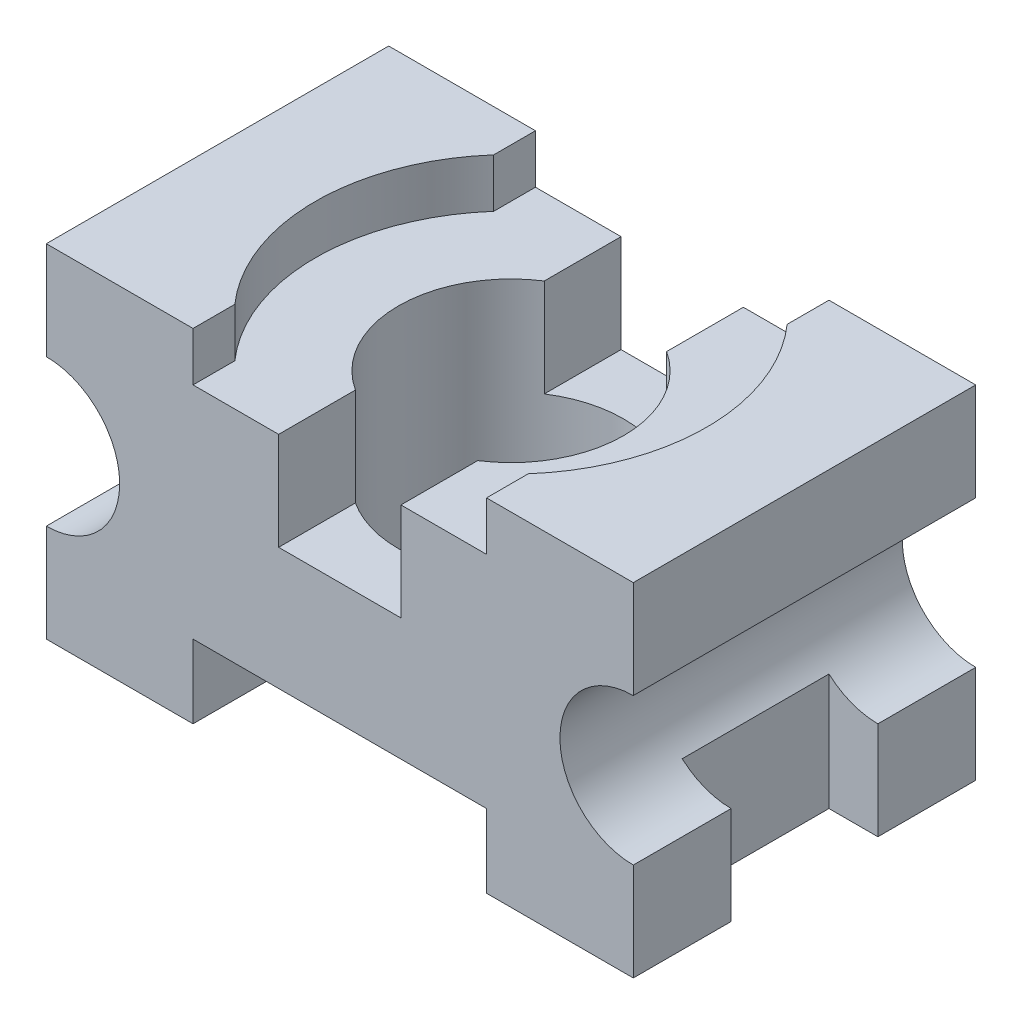
ISO-10303-21;
HEADER;
FILE_DESCRIPTION(('STEP AP214'),'2;1');
FILE_NAME('part.step','',(''),(''),'','','');
FILE_SCHEMA(('AUTOMOTIVE_DESIGN { 1 0 10303 214 1 1 1 1 }'));
ENDSEC;
DATA;
#1=APPLICATION_CONTEXT('core data for automotive mechanical design processes');
#2=APPLICATION_PROTOCOL_DEFINITION('international standard','automotive_design',2000,#1);
#3=PRODUCT_CONTEXT('',#1,'mechanical');
#4=PRODUCT('Part','Part','',(#3));
#5=PRODUCT_RELATED_PRODUCT_CATEGORY('part','',(#4));
#6=PRODUCT_DEFINITION_FORMATION('','',#4);
#7=PRODUCT_DEFINITION_CONTEXT('part definition',#1,'design');
#8=PRODUCT_DEFINITION('design','',#6,#7);
#9=PRODUCT_DEFINITION_SHAPE('','',#8);
#10=(LENGTH_UNIT() NAMED_UNIT(*) SI_UNIT(.MILLI.,.METRE.));
#11=(NAMED_UNIT(*) PLANE_ANGLE_UNIT() SI_UNIT($,.RADIAN.));
#12=(NAMED_UNIT(*) SI_UNIT($,.STERADIAN.) SOLID_ANGLE_UNIT());
#13=UNCERTAINTY_MEASURE_WITH_UNIT(LENGTH_MEASURE(1.E-05),#10,'distance_accuracy_value','');
#14=(GEOMETRIC_REPRESENTATION_CONTEXT(3) GLOBAL_UNCERTAINTY_ASSIGNED_CONTEXT((#13)) GLOBAL_UNIT_ASSIGNED_CONTEXT((#10,
#11,#12)) REPRESENTATION_CONTEXT('',''));
#15=CARTESIAN_POINT('',(0.,0.,0.));
#16=DIRECTION('',(0.,0.,1.));
#17=DIRECTION('',(1.,0.,0.));
#18=AXIS2_PLACEMENT_3D('',#15,#16,#17);
#19=CARTESIAN_POINT('',(59.9369075355242,-25.7154386100894,70.));
#20=DIRECTION('',(-1.,0.,0.));
#21=DIRECTION('',(0.,0.,1.));
#22=AXIS2_PLACEMENT_3D('',#19,#20,#21);
#23=PLANE('',#22);
#24=DIRECTION('',(0.,0.,-1.));
#25=VECTOR('',#24,1.);
#26=CARTESIAN_POINT('',(59.9369075355242,-45.7154386100894,70.));
#27=LINE('',#26,#25);
#28=CARTESIAN_POINT('',(59.9369075355242,-45.7154386100894,70.));
#29=VERTEX_POINT('',#28);
#30=CARTESIAN_POINT('',(59.9369075355242,-45.7154386100894,50.));
#31=VERTEX_POINT('',#30);
#32=EDGE_CURVE('E591',#29,#31,#27,.T.);
#33=ORIENTED_EDGE('',*,*,#32,.T.);
#34=DIRECTION('',(0.,-1.,0.));
#35=VECTOR('',#34,1.);
#36=CARTESIAN_POINT('',(59.9369075355242,0.,50.));
#37=LINE('',#36,#35);
#38=CARTESIAN_POINT('',(59.9369075355242,-25.7154386100894,50.));
#39=VERTEX_POINT('',#38);
#40=EDGE_CURVE('E287',#39,#31,#37,.T.);
#41=ORIENTED_EDGE('',*,*,#40,.F.);
#42=DIRECTION('',(0.,0.,-1.));
#43=VECTOR('',#42,1.);
#44=CARTESIAN_POINT('',(59.9369075355242,-25.7154386100894,70.));
#45=LINE('',#44,#43);
#46=CARTESIAN_POINT('',(59.9369075355242,-25.7154386100894,70.));
#47=VERTEX_POINT('',#46);
#48=EDGE_CURVE('E586',#47,#39,#45,.T.);
#49=ORIENTED_EDGE('',*,*,#48,.F.);
#50=DIRECTION('',(0.,1.,0.));
#51=VECTOR('',#50,1.);
#52=CARTESIAN_POINT('',(59.9369075355242,-25.7154386100894,70.));
#53=LINE('',#52,#51);
#54=EDGE_CURVE('E404',#29,#47,#53,.T.);
#55=ORIENTED_EDGE('',*,*,#54,.F.);
#56=EDGE_LOOP('',(#33,#41,#49,#55));
#57=FACE_BOUND('',#56,.T.);
#58=ADVANCED_FACE('F39',(#57),#23,.F.);
#59=CARTESIAN_POINT('',(-60.0630924644758,-45.7154386100894,70.));
#60=DIRECTION('',(0.,1.,0.));
#61=DIRECTION('',(0.,0.,1.));
#62=AXIS2_PLACEMENT_3D('',#59,#60,#61);
#63=PLANE('',#62);
#64=DIRECTION('',(-1.,0.,0.));
#65=VECTOR('',#64,1.);
#66=CARTESIAN_POINT('',(-50.0630924644758,-45.7154386100894,50.));
#67=LINE('',#66,#65);
#68=CARTESIAN_POINT('',(-50.0630924644758,-45.7154386100894,50.));
#69=VERTEX_POINT('',#68);
#70=CARTESIAN_POINT('',(-60.0630924644758,-45.7154386100894,50.));
#71=VERTEX_POINT('',#70);
#72=EDGE_CURVE('E322',#69,#71,#67,.T.);
#73=ORIENTED_EDGE('',*,*,#72,.F.);
#74=DIRECTION('',(0.,0.,1.));
#75=VECTOR('',#74,1.);
#76=CARTESIAN_POINT('',(-50.0630924644758,-45.7154386100894,0.));
#77=LINE('',#76,#75);
#78=CARTESIAN_POINT('',(-50.0630924644758,-45.7154386100894,20.));
#79=VERTEX_POINT('',#78);
#80=EDGE_CURVE('E315',#79,#69,#77,.T.);
#81=ORIENTED_EDGE('',*,*,#80,.F.);
#82=DIRECTION('',(-1.,0.,0.));
#83=VECTOR('',#82,1.);
#84=CARTESIAN_POINT('',(-50.0630924644758,-45.7154386100894,20.));
#85=LINE('',#84,#83);
#86=CARTESIAN_POINT('',(-60.0630924644758,-45.7154386100894,20.));
#87=VERTEX_POINT('',#86);
#88=EDGE_CURVE('E319',#79,#87,#85,.T.);
#89=ORIENTED_EDGE('',*,*,#88,.T.);
#90=DIRECTION('',(0.,0.,-1.));
#91=VECTOR('',#90,1.);
#92=CARTESIAN_POINT('',(-60.0630924644758,-45.7154386100894,70.));
#93=LINE('',#92,#91);
#94=CARTESIAN_POINT('',(-60.0630924644758,-45.7154386100894,0.));
#95=VERTEX_POINT('',#94);
#96=EDGE_CURVE('E449',#87,#95,#93,.T.);
#97=ORIENTED_EDGE('',*,*,#96,.T.);
#98=DIRECTION('',(1.,0.,0.));
#99=VECTOR('',#98,1.);
#100=CARTESIAN_POINT('',(-60.0630924644758,-45.7154386100894,0.));
#101=LINE('',#100,#99);
#102=CARTESIAN_POINT('',(-30.0630924644758,-45.7154386100894,0.));
#103=VERTEX_POINT('',#102);
#104=EDGE_CURVE('E386',#95,#103,#101,.T.);
#105=ORIENTED_EDGE('',*,*,#104,.T.);
#106=DIRECTION('',(0.,0.,-1.));
#107=VECTOR('',#106,1.);
#108=CARTESIAN_POINT('',(-30.0630924644758,-45.7154386100894,70.));
#109=LINE('',#108,#107);
#110=CARTESIAN_POINT('',(-30.0630924644758,-45.7154386100894,70.));
#111=VERTEX_POINT('',#110);
#112=EDGE_CURVE('E606',#111,#103,#109,.T.);
#113=ORIENTED_EDGE('',*,*,#112,.F.);
#114=DIRECTION('',(1.,0.,0.));
#115=VECTOR('',#114,1.);
#116=CARTESIAN_POINT('',(-60.0630924644758,-45.7154386100894,70.));
#117=LINE('',#116,#115);
#118=CARTESIAN_POINT('',(-60.0630924644758,-45.7154386100894,70.));
#119=VERTEX_POINT('',#118);
#120=EDGE_CURVE('E387',#119,#111,#117,.T.);
#121=ORIENTED_EDGE('',*,*,#120,.F.);
#122=EDGE_CURVE('E520',#119,#71,#93,.T.);
#123=ORIENTED_EDGE('',*,*,#122,.T.);
#124=EDGE_LOOP('',(#73,#81,#89,#97,#105,#113,#121,#123));
#125=FACE_BOUND('',#124,.T.);
#126=ADVANCED_FACE('F41',(#125),#63,.F.);
#127=CARTESIAN_POINT('',(-60.0630924644758,-10.7154386100894,70.));
#128=DIRECTION('',(0.,0.,-1.));
#129=DIRECTION('',(-1.,0.,0.));
#130=AXIS2_PLACEMENT_3D('',#127,#128,#129);
#131=CYLINDRICAL_SURFACE('',#130,15.);
#132=CARTESIAN_POINT('',(-60.0630924644758,-10.7154386100894,50.));
#133=DIRECTION('',(0.,0.,-1.));
#134=DIRECTION('',(-1.,0.,0.));
#135=AXIS2_PLACEMENT_3D('',#132,#133,#134);
#136=CIRCLE('',#135,15.);
#137=CARTESIAN_POINT('',(-60.0630924644758,-25.7154386100894,50.));
#138=VERTEX_POINT('',#137);
#139=CARTESIAN_POINT('',(-50.0630924644758,-21.8957784975883,50.));
#140=VERTEX_POINT('',#139);
#141=EDGE_CURVE('E330',#138,#140,#136,.F.);
#142=ORIENTED_EDGE('',*,*,#141,.F.);
#143=DIRECTION('',(0.,0.,-1.));
#144=VECTOR('',#143,1.);
#145=CARTESIAN_POINT('',(-60.0630924644758,-25.7154386100894,70.));
#146=LINE('',#145,#144);
#147=CARTESIAN_POINT('',(-60.0630924644758,-25.7154386100894,70.));
#148=VERTEX_POINT('',#147);
#149=EDGE_CURVE('E525',#148,#138,#146,.T.);
#150=ORIENTED_EDGE('',*,*,#149,.F.);
#151=CARTESIAN_POINT('',(-60.0630924644758,-10.7154386100894,70.));
#152=DIRECTION('',(0.,0.,-1.));
#153=DIRECTION('',(1.,0.,0.));
#154=AXIS2_PLACEMENT_3D('',#151,#152,#153);
#155=CIRCLE('',#154,15.);
#156=CARTESIAN_POINT('',(-60.0630924644758,4.28456138991064,70.));
#157=VERTEX_POINT('',#156);
#158=EDGE_CURVE('E443',#157,#148,#155,.T.);
#159=ORIENTED_EDGE('',*,*,#158,.F.);
#160=DIRECTION('',(0.,0.,-1.));
#161=VECTOR('',#160,1.);
#162=CARTESIAN_POINT('',(-60.0630924644758,4.28456138991064,70.));
#163=LINE('',#162,#161);
#164=CARTESIAN_POINT('',(-60.0630924644758,4.28456138991064,0.));
#165=VERTEX_POINT('',#164);
#166=EDGE_CURVE('E529',#157,#165,#163,.T.);
#167=ORIENTED_EDGE('',*,*,#166,.T.);
#168=CARTESIAN_POINT('',(-60.0630924644758,-10.7154386100894,0.));
#169=DIRECTION('',(0.,0.,-1.));
#170=DIRECTION('',(1.,0.,0.));
#171=AXIS2_PLACEMENT_3D('',#168,#169,#170);
#172=CIRCLE('',#171,15.);
#173=CARTESIAN_POINT('',(-60.0630924644758,-25.7154386100894,0.));
#174=VERTEX_POINT('',#173);
#175=EDGE_CURVE('E513',#165,#174,#172,.T.);
#176=ORIENTED_EDGE('',*,*,#175,.T.);
#177=CARTESIAN_POINT('',(-60.0630924644758,-25.7154386100894,20.));
#178=VERTEX_POINT('',#177);
#179=EDGE_CURVE('E524',#178,#174,#146,.T.);
#180=ORIENTED_EDGE('',*,*,#179,.F.);
#181=CARTESIAN_POINT('',(-60.0630924644758,-10.7154386100894,20.));
#182=DIRECTION('',(0.,0.,1.));
#183=DIRECTION('',(1.,0.,0.));
#184=AXIS2_PLACEMENT_3D('',#181,#182,#183);
#185=CIRCLE('',#184,15.);
#186=CARTESIAN_POINT('',(-50.0630924644758,-21.8957784975883,20.));
#187=VERTEX_POINT('',#186);
#188=EDGE_CURVE('E63',#187,#178,#185,.F.);
#189=ORIENTED_EDGE('',*,*,#188,.F.);
#190=DIRECTION('',(0.,0.,-1.));
#191=VECTOR('',#190,1.);
#192=CARTESIAN_POINT('',(-50.0630924644758,-21.8957784975883,70.));
#193=LINE('',#192,#191);
#194=EDGE_CURVE('E617',#140,#187,#193,.T.);
#195=ORIENTED_EDGE('',*,*,#194,.F.);
#196=EDGE_LOOP('',(#142,#150,#159,#167,#176,#180,#189,#195));
#197=FACE_BOUND('',#196,.T.);
#198=ADVANCED_FACE('F710',(#197),#131,.F.);
#199=CARTESIAN_POINT('',(-60.0630924644758,-25.7154386100894,70.));
#200=DIRECTION('',(1.,0.,0.));
#201=DIRECTION('',(0.,0.,-1.));
#202=AXIS2_PLACEMENT_3D('',#199,#200,#201);
#203=PLANE('',#202);
#204=DIRECTION('',(0.,1.,0.));
#205=VECTOR('',#204,1.);
#206=CARTESIAN_POINT('',(-60.0630924644758,-25.7154386100894,50.));
#207=LINE('',#206,#205);
#208=EDGE_CURVE('E614',#71,#138,#207,.T.);
#209=ORIENTED_EDGE('',*,*,#208,.F.);
#210=ORIENTED_EDGE('',*,*,#122,.F.);
#211=DIRECTION('',(0.,-1.,0.));
#212=VECTOR('',#211,1.);
#213=CARTESIAN_POINT('',(-60.0630924644758,-25.7154386100894,70.));
#214=LINE('',#213,#212);
#215=EDGE_CURVE('E446',#148,#119,#214,.T.);
#216=ORIENTED_EDGE('',*,*,#215,.F.);
#217=ORIENTED_EDGE('',*,*,#149,.T.);
#218=EDGE_LOOP('',(#209,#210,#216,#217));
#219=FACE_BOUND('',#218,.T.);
#220=ADVANCED_FACE('F717',(#219),#203,.F.);
#221=DIRECTION('',(0.,1.,0.));
#222=VECTOR('',#221,1.);
#223=CARTESIAN_POINT('',(-60.0630924644758,0.,20.));
#224=LINE('',#223,#222);
#225=EDGE_CURVE('E307',#87,#178,#224,.T.);
#226=ORIENTED_EDGE('',*,*,#225,.T.);
#227=ORIENTED_EDGE('',*,*,#179,.T.);
#228=DIRECTION('',(0.,-1.,0.));
#229=VECTOR('',#228,1.);
#230=CARTESIAN_POINT('',(-60.0630924644758,-25.7154386100894,0.));
#231=LINE('',#230,#229);
#232=EDGE_CURVE('E392',#174,#95,#231,.T.);
#233=ORIENTED_EDGE('',*,*,#232,.T.);
#234=ORIENTED_EDGE('',*,*,#96,.F.);
#235=EDGE_LOOP('',(#226,#227,#233,#234));
#236=FACE_BOUND('',#235,.T.);
#237=ADVANCED_FACE('F904',(#236),#203,.F.);
#238=CARTESIAN_POINT('',(12.4369075355242,14.2845613899106,70.));
#239=DIRECTION('',(1.,0.,0.));
#240=DIRECTION('',(0.,0.,-1.));
#241=AXIS2_PLACEMENT_3D('',#238,#239,#240);
#242=PLANE('',#241);
#243=DIRECTION('',(0.,0.,-1.));
#244=VECTOR('',#243,1.);
#245=CARTESIAN_POINT('',(12.4369075355242,-5.71543861008936,70.));
#246=LINE('',#245,#244);
#247=CARTESIAN_POINT('',(12.4369075355242,-5.71543861008936,15.6932654236922));
#248=VERTEX_POINT('',#247);
#249=CARTESIAN_POINT('',(12.4369075355242,-5.71543861008936,0.));
#250=VERTEX_POINT('',#249);
#251=EDGE_CURVE('E557',#248,#250,#246,.T.);
#252=ORIENTED_EDGE('',*,*,#251,.F.);
#253=DIRECTION('',(0.,1.,0.));
#254=VECTOR('',#253,1.);
#255=CARTESIAN_POINT('',(12.4369075355242,-51.7154386100894,15.6932654236922));
#256=LINE('',#255,#254);
#257=CARTESIAN_POINT('',(12.4369075355242,14.2845613899106,15.6932654236922));
#258=VERTEX_POINT('',#257);
#259=EDGE_CURVE('E344',#248,#258,#256,.T.);
#260=ORIENTED_EDGE('',*,*,#259,.T.);
#261=DIRECTION('',(0.,0.,-1.));
#262=VECTOR('',#261,1.);
#263=CARTESIAN_POINT('',(12.4369075355242,14.2845613899106,70.));
#264=LINE('',#263,#262);
#265=CARTESIAN_POINT('',(12.4369075355242,14.2845613899106,0.));
#266=VERTEX_POINT('',#265);
#267=EDGE_CURVE('E562',#258,#266,#264,.T.);
#268=ORIENTED_EDGE('',*,*,#267,.T.);
#269=DIRECTION('',(0.,-1.,0.));
#270=VECTOR('',#269,1.);
#271=CARTESIAN_POINT('',(12.4369075355242,14.2845613899106,0.));
#272=LINE('',#271,#270);
#273=EDGE_CURVE('E488',#266,#250,#272,.T.);
#274=ORIENTED_EDGE('',*,*,#273,.T.);
#275=EDGE_LOOP('',(#252,#260,#268,#274));
#276=FACE_BOUND('',#275,.T.);
#277=ADVANCED_FACE('F678',(#276),#242,.F.);
#278=CARTESIAN_POINT('',(-12.5630924644758,-5.71543861008936,70.));
#279=DIRECTION('',(0.,-1.,0.));
#280=DIRECTION('',(0.,0.,-1.));
#281=AXIS2_PLACEMENT_3D('',#278,#279,#280);
#282=PLANE('',#281);
#283=CARTESIAN_POINT('',(12.4369075355242,-5.71543861008936,70.));
#284=VERTEX_POINT('',#283);
#285=CARTESIAN_POINT('',(12.4369075355242,-5.71543861008936,54.3067345763078));
#286=VERTEX_POINT('',#285);
#287=EDGE_CURVE('E558',#284,#286,#246,.T.);
#288=ORIENTED_EDGE('',*,*,#287,.T.);
#289=CARTESIAN_POINT('',(-0.063092464475837,-5.71543861008936,35.));
#290=DIRECTION('',(0.,-1.,0.));
#291=DIRECTION('',(0.,0.,-1.));
#292=AXIS2_PLACEMENT_3D('',#289,#290,#291);
#293=CIRCLE('',#292,23.);
#294=CARTESIAN_POINT('',(-12.5630924644758,-5.71543861008936,54.3067345763078));
#295=VERTEX_POINT('',#294);
#296=EDGE_CURVE('E345',#286,#295,#293,.T.);
#297=ORIENTED_EDGE('',*,*,#296,.T.);
#298=DIRECTION('',(0.,0.,-1.));
#299=VECTOR('',#298,1.);
#300=CARTESIAN_POINT('',(-12.5630924644758,-5.71543861008936,70.));
#301=LINE('',#300,#299);
#302=CARTESIAN_POINT('',(-12.5630924644758,-5.71543861008936,70.));
#303=VERTEX_POINT('',#302);
#304=EDGE_CURVE('E553',#303,#295,#301,.T.);
#305=ORIENTED_EDGE('',*,*,#304,.F.);
#306=DIRECTION('',(-1.,0.,0.));
#307=VECTOR('',#306,1.);
#308=CARTESIAN_POINT('',(-12.5630924644758,-5.71543861008936,70.));
#309=LINE('',#308,#307);
#310=EDGE_CURVE('E425',#284,#303,#309,.T.);
#311=ORIENTED_EDGE('',*,*,#310,.F.);
#312=EDGE_LOOP('',(#288,#297,#305,#311));
#313=FACE_BOUND('',#312,.T.);
#314=ADVANCED_FACE('F651',(#313),#282,.F.);
#315=CARTESIAN_POINT('',(-12.5630924644758,14.2845613899106,70.));
#316=DIRECTION('',(-1.,0.,0.));
#317=DIRECTION('',(0.,0.,1.));
#318=AXIS2_PLACEMENT_3D('',#315,#316,#317);
#319=PLANE('',#318);
#320=ORIENTED_EDGE('',*,*,#304,.T.);
#321=DIRECTION('',(0.,1.,0.));
#322=VECTOR('',#321,1.);
#323=CARTESIAN_POINT('',(-12.5630924644758,-51.7154386100894,54.3067345763078));
#324=LINE('',#323,#322);
#325=CARTESIAN_POINT('',(-12.5630924644758,14.2845613899106,54.3067345763078));
#326=VERTEX_POINT('',#325);
#327=EDGE_CURVE('E349',#295,#326,#324,.T.);
#328=ORIENTED_EDGE('',*,*,#327,.T.);
#329=DIRECTION('',(0.,0.,-1.));
#330=VECTOR('',#329,1.);
#331=CARTESIAN_POINT('',(-12.5630924644758,14.2845613899106,70.));
#332=LINE('',#331,#330);
#333=CARTESIAN_POINT('',(-12.5630924644758,14.2845613899106,70.));
#334=VERTEX_POINT('',#333);
#335=EDGE_CURVE('E548',#334,#326,#332,.T.);
#336=ORIENTED_EDGE('',*,*,#335,.F.);
#337=DIRECTION('',(0.,1.,0.));
#338=VECTOR('',#337,1.);
#339=CARTESIAN_POINT('',(-12.5630924644758,14.2845613899106,70.));
#340=LINE('',#339,#338);
#341=EDGE_CURVE('E428',#303,#334,#340,.T.);
#342=ORIENTED_EDGE('',*,*,#341,.F.);
#343=EDGE_LOOP('',(#320,#328,#336,#342));
#344=FACE_BOUND('',#343,.T.);
#345=ADVANCED_FACE('F657',(#344),#319,.F.);
#346=CARTESIAN_POINT('',(29.9369075355242,24.2845613899106,70.));
#347=DIRECTION('',(1.,0.,0.));
#348=DIRECTION('',(0.,0.,-1.));
#349=AXIS2_PLACEMENT_3D('',#346,#347,#348);
#350=PLANE('',#349);
#351=DIRECTION('',(0.,0.,-1.));
#352=VECTOR('',#351,1.);
#353=CARTESIAN_POINT('',(29.9369075355242,14.2845613899106,70.));
#354=LINE('',#353,#352);
#355=CARTESIAN_POINT('',(29.9369075355242,14.2845613899106,8.5424868893541));
#356=VERTEX_POINT('',#355);
#357=CARTESIAN_POINT('',(29.9369075355242,14.2845613899106,0.));
#358=VERTEX_POINT('',#357);
#359=EDGE_CURVE('E567',#356,#358,#354,.T.);
#360=ORIENTED_EDGE('',*,*,#359,.F.);
#361=DIRECTION('',(0.,1.,0.));
#362=VECTOR('',#361,1.);
#363=CARTESIAN_POINT('',(29.9369075355242,14.2845613899106,8.5424868893541));
#364=LINE('',#363,#362);
#365=CARTESIAN_POINT('',(29.9369075355242,24.2845613899106,8.5424868893541));
#366=VERTEX_POINT('',#365);
#367=EDGE_CURVE('E382',#356,#366,#364,.T.);
#368=ORIENTED_EDGE('',*,*,#367,.T.);
#369=DIRECTION('',(0.,0.,-1.));
#370=VECTOR('',#369,1.);
#371=CARTESIAN_POINT('',(29.9369075355242,24.2845613899106,70.));
#372=LINE('',#371,#370);
#373=CARTESIAN_POINT('',(29.9369075355242,24.2845613899106,0.));
#374=VERTEX_POINT('',#373);
#375=EDGE_CURVE('E572',#366,#374,#372,.T.);
#376=ORIENTED_EDGE('',*,*,#375,.T.);
#377=DIRECTION('',(0.,-1.,0.));
#378=VECTOR('',#377,1.);
#379=CARTESIAN_POINT('',(29.9369075355242,24.2845613899106,0.));
#380=LINE('',#379,#378);
#381=EDGE_CURVE('E480',#374,#358,#380,.T.);
#382=ORIENTED_EDGE('',*,*,#381,.T.);
#383=EDGE_LOOP('',(#360,#368,#376,#382));
#384=FACE_BOUND('',#383,.T.);
#385=ADVANCED_FACE('F761',(#384),#350,.F.);
#386=CARTESIAN_POINT('',(-30.0630924644758,24.2845613899106,70.));
#387=DIRECTION('',(-1.,0.,0.));
#388=DIRECTION('',(0.,0.,1.));
#389=AXIS2_PLACEMENT_3D('',#386,#387,#388);
#390=PLANE('',#389);
#391=DIRECTION('',(0.,0.,-1.));
#392=VECTOR('',#391,1.);
#393=CARTESIAN_POINT('',(-30.0630924644758,14.2845613899106,70.));
#394=LINE('',#393,#392);
#395=CARTESIAN_POINT('',(-30.0630924644758,14.2845613899106,70.));
#396=VERTEX_POINT('',#395);
#397=CARTESIAN_POINT('',(-30.0630924644758,14.2845613899106,61.4575131106459));
#398=VERTEX_POINT('',#397);
#399=EDGE_CURVE('E543',#396,#398,#394,.T.);
#400=ORIENTED_EDGE('',*,*,#399,.T.);
#401=DIRECTION('',(0.,1.,0.));
#402=VECTOR('',#401,1.);
#403=CARTESIAN_POINT('',(-30.0630924644758,14.2845613899106,61.4575131106459));
#404=LINE('',#403,#402);
#405=CARTESIAN_POINT('',(-30.0630924644758,24.2845613899106,61.4575131106459));
#406=VERTEX_POINT('',#405);
#407=EDGE_CURVE('E374',#398,#406,#404,.T.);
#408=ORIENTED_EDGE('',*,*,#407,.T.);
#409=DIRECTION('',(0.,0.,-1.));
#410=VECTOR('',#409,1.);
#411=CARTESIAN_POINT('',(-30.0630924644758,24.2845613899106,70.));
#412=LINE('',#411,#410);
#413=CARTESIAN_POINT('',(-30.0630924644758,24.2845613899106,70.));
#414=VERTEX_POINT('',#413);
#415=EDGE_CURVE('E538',#414,#406,#412,.T.);
#416=ORIENTED_EDGE('',*,*,#415,.F.);
#417=DIRECTION('',(0.,1.,0.));
#418=VECTOR('',#417,1.);
#419=CARTESIAN_POINT('',(-30.0630924644758,24.2845613899106,70.));
#420=LINE('',#419,#418);
#421=EDGE_CURVE('E434',#396,#414,#420,.T.);
#422=ORIENTED_EDGE('',*,*,#421,.F.);
#423=EDGE_LOOP('',(#400,#408,#416,#422));
#424=FACE_BOUND('',#423,.T.);
#425=ADVANCED_FACE('F694',(#424),#390,.F.);
#426=CARTESIAN_POINT('',(-30.0630924644758,-45.7154386100894,70.));
#427=DIRECTION('',(-1.,0.,0.));
#428=DIRECTION('',(0.,0.,1.));
#429=AXIS2_PLACEMENT_3D('',#426,#427,#428);
#430=PLANE('',#429);
#431=DIRECTION('',(0.,1.,0.));
#432=VECTOR('',#431,1.);
#433=CARTESIAN_POINT('',(-30.0630924644758,-45.7154386100894,0.));
#434=LINE('',#433,#432);
#435=CARTESIAN_POINT('',(-30.0630924644758,-30.7154386100894,0.));
#436=VERTEX_POINT('',#435);
#437=EDGE_CURVE('E453',#103,#436,#434,.T.);
#438=ORIENTED_EDGE('',*,*,#437,.T.);
#439=DIRECTION('',(0.,0.,-1.));
#440=VECTOR('',#439,1.);
#441=CARTESIAN_POINT('',(-30.0630924644758,-30.7154386100894,70.));
#442=LINE('',#441,#440);
#443=CARTESIAN_POINT('',(-30.0630924644758,-30.7154386100894,70.));
#444=VERTEX_POINT('',#443);
#445=EDGE_CURVE('E602',#444,#436,#442,.T.);
#446=ORIENTED_EDGE('',*,*,#445,.F.);
#447=DIRECTION('',(0.,1.,0.));
#448=VECTOR('',#447,1.);
#449=CARTESIAN_POINT('',(-30.0630924644758,-45.7154386100894,70.));
#450=LINE('',#449,#448);
#451=EDGE_CURVE('E391',#111,#444,#450,.T.);
#452=ORIENTED_EDGE('',*,*,#451,.F.);
#453=ORIENTED_EDGE('',*,*,#112,.T.);
#454=EDGE_LOOP('',(#438,#446,#452,#453));
#455=FACE_BOUND('',#454,.T.);
#456=ADVANCED_FACE('F722',(#455),#430,.F.);
#457=CARTESIAN_POINT('',(-30.0630924644758,-30.7154386100894,70.));
#458=DIRECTION('',(0.,1.,0.));
#459=DIRECTION('',(0.,0.,1.));
#460=AXIS2_PLACEMENT_3D('',#457,#458,#459);
#461=PLANE('',#460);
#462=CARTESIAN_POINT('',(-0.063092464475837,-30.7154386100894,35.));
#463=DIRECTION('',(0.,1.,0.));
#464=DIRECTION('',(0.,0.,1.));
#465=AXIS2_PLACEMENT_3D('',#462,#463,#464);
#466=CIRCLE('',#465,23.);
#467=CARTESIAN_POINT('',(-0.063092464475837,-30.7154386100894,58.));
#468=VERTEX_POINT('',#467);
#469=EDGE_CURVE('E357',#468,#468,#466,.T.);
#470=ORIENTED_EDGE('',*,*,#469,.T.);
#471=EDGE_LOOP('',(#470));
#472=FACE_BOUND('',#471,.T.);
#473=DIRECTION('',(1.,0.,0.));
#474=VECTOR('',#473,1.);
#475=CARTESIAN_POINT('',(-30.0630924644758,-30.7154386100894,0.));
#476=LINE('',#475,#474);
#477=CARTESIAN_POINT('',(29.9369075355242,-30.7154386100894,0.));
#478=VERTEX_POINT('',#477);
#479=EDGE_CURVE('E456',#436,#478,#476,.T.);
#480=ORIENTED_EDGE('',*,*,#479,.T.);
#481=DIRECTION('',(0.,0.,-1.));
#482=VECTOR('',#481,1.);
#483=CARTESIAN_POINT('',(29.9369075355242,-30.7154386100894,70.));
#484=LINE('',#483,#482);
#485=CARTESIAN_POINT('',(29.9369075355242,-30.7154386100894,70.));
#486=VERTEX_POINT('',#485);
#487=EDGE_CURVE('E598',#486,#478,#484,.T.);
#488=ORIENTED_EDGE('',*,*,#487,.F.);
#489=DIRECTION('',(1.,0.,0.));
#490=VECTOR('',#489,1.);
#491=CARTESIAN_POINT('',(-30.0630924644758,-30.7154386100894,70.));
#492=LINE('',#491,#490);
#493=EDGE_CURVE('E395',#444,#486,#492,.T.);
#494=ORIENTED_EDGE('',*,*,#493,.F.);
#495=ORIENTED_EDGE('',*,*,#445,.T.);
#496=EDGE_LOOP('',(#480,#488,#494,#495));
#497=FACE_BOUND('',#496,.T.);
#498=ADVANCED_FACE('F729',(#472,#497),#461,.F.);
#499=CARTESIAN_POINT('',(29.9369075355242,-45.7154386100894,70.));
#500=DIRECTION('',(1.,0.,0.));
#501=DIRECTION('',(0.,0.,-1.));
#502=AXIS2_PLACEMENT_3D('',#499,#500,#501);
#503=PLANE('',#502);
#504=DIRECTION('',(0.,-1.,0.));
#505=VECTOR('',#504,1.);
#506=CARTESIAN_POINT('',(29.9369075355242,-45.7154386100894,0.));
#507=LINE('',#506,#505);
#508=CARTESIAN_POINT('',(29.9369075355242,-45.7154386100894,0.));
#509=VERTEX_POINT('',#508);
#510=EDGE_CURVE('E459',#478,#509,#507,.T.);
#511=ORIENTED_EDGE('',*,*,#510,.T.);
#512=DIRECTION('',(0.,0.,-1.));
#513=VECTOR('',#512,1.);
#514=CARTESIAN_POINT('',(29.9369075355242,-45.7154386100894,70.));
#515=LINE('',#514,#513);
#516=CARTESIAN_POINT('',(29.9369075355242,-45.7154386100894,70.));
#517=VERTEX_POINT('',#516);
#518=EDGE_CURVE('E594',#517,#509,#515,.T.);
#519=ORIENTED_EDGE('',*,*,#518,.F.);
#520=DIRECTION('',(0.,-1.,0.));
#521=VECTOR('',#520,1.);
#522=CARTESIAN_POINT('',(29.9369075355242,-45.7154386100894,70.));
#523=LINE('',#522,#521);
#524=EDGE_CURVE('E398',#486,#517,#523,.T.);
#525=ORIENTED_EDGE('',*,*,#524,.F.);
#526=ORIENTED_EDGE('',*,*,#487,.T.);
#527=EDGE_LOOP('',(#511,#519,#525,#526));
#528=FACE_BOUND('',#527,.T.);
#529=ADVANCED_FACE('F733',(#528),#503,.F.);
#530=CARTESIAN_POINT('',(59.9369075355242,-45.7154386100894,70.));
#531=DIRECTION('',(0.,1.,0.));
#532=DIRECTION('',(0.,0.,1.));
#533=AXIS2_PLACEMENT_3D('',#530,#531,#532);
#534=PLANE('',#533);
#535=DIRECTION('',(0.,0.,1.));
#536=VECTOR('',#535,1.);
#537=CARTESIAN_POINT('',(49.9369075355242,-45.7154386100894,0.));
#538=LINE('',#537,#536);
#539=CARTESIAN_POINT('',(49.9369075355242,-45.7154386100894,20.));
#540=VERTEX_POINT('',#539);
#541=CARTESIAN_POINT('',(49.9369075355242,-45.7154386100894,50.));
#542=VERTEX_POINT('',#541);
#543=EDGE_CURVE('E276',#540,#542,#538,.T.);
#544=ORIENTED_EDGE('',*,*,#543,.T.);
#545=DIRECTION('',(1.,0.,0.));
#546=VECTOR('',#545,1.);
#547=CARTESIAN_POINT('',(49.9369075355242,-45.7154386100894,50.));
#548=LINE('',#547,#546);
#549=EDGE_CURVE('E284',#542,#31,#548,.T.);
#550=ORIENTED_EDGE('',*,*,#549,.T.);
#551=ORIENTED_EDGE('',*,*,#32,.F.);
#552=DIRECTION('',(1.,0.,0.));
#553=VECTOR('',#552,1.);
#554=CARTESIAN_POINT('',(59.9369075355242,-45.7154386100894,70.));
#555=LINE('',#554,#553);
#556=EDGE_CURVE('E401',#517,#29,#555,.T.);
#557=ORIENTED_EDGE('',*,*,#556,.F.);
#558=ORIENTED_EDGE('',*,*,#518,.T.);
#559=DIRECTION('',(1.,0.,0.));
#560=VECTOR('',#559,1.);
#561=CARTESIAN_POINT('',(59.9369075355242,-45.7154386100894,0.));
#562=LINE('',#561,#560);
#563=CARTESIAN_POINT('',(59.9369075355242,-45.7154386100894,0.));
#564=VERTEX_POINT('',#563);
#565=EDGE_CURVE('E462',#509,#564,#562,.T.);
#566=ORIENTED_EDGE('',*,*,#565,.T.);
#567=CARTESIAN_POINT('',(59.9369075355242,-45.7154386100894,20.));
#568=VERTEX_POINT('',#567);
#569=EDGE_CURVE('E590',#568,#564,#27,.T.);
#570=ORIENTED_EDGE('',*,*,#569,.F.);
#571=DIRECTION('',(1.,0.,0.));
#572=VECTOR('',#571,1.);
#573=CARTESIAN_POINT('',(49.9369075355242,-45.7154386100894,20.));
#574=LINE('',#573,#572);
#575=EDGE_CURVE('E292',#540,#568,#574,.T.);
#576=ORIENTED_EDGE('',*,*,#575,.F.);
#577=EDGE_LOOP('',(#544,#550,#551,#557,#558,#566,#570,#576));
#578=FACE_BOUND('',#577,.T.);
#579=ADVANCED_FACE('F295',(#578),#534,.F.);
#580=CARTESIAN_POINT('',(59.9369075355242,-25.7154386100894,20.));
#581=VERTEX_POINT('',#580);
#582=CARTESIAN_POINT('',(59.9369075355242,-25.7154386100894,0.));
#583=VERTEX_POINT('',#582);
#584=EDGE_CURVE('E585',#581,#583,#45,.T.);
#585=ORIENTED_EDGE('',*,*,#584,.F.);
#586=DIRECTION('',(0.,1.,0.));
#587=VECTOR('',#586,1.);
#588=CARTESIAN_POINT('',(59.9369075355242,0.,20.));
#589=LINE('',#588,#587);
#590=EDGE_CURVE('E281',#568,#581,#589,.T.);
#591=ORIENTED_EDGE('',*,*,#590,.F.);
#592=ORIENTED_EDGE('',*,*,#569,.T.);
#593=DIRECTION('',(0.,1.,0.));
#594=VECTOR('',#593,1.);
#595=CARTESIAN_POINT('',(59.9369075355242,-25.7154386100894,0.));
#596=LINE('',#595,#594);
#597=EDGE_CURVE('E466',#564,#583,#596,.T.);
#598=ORIENTED_EDGE('',*,*,#597,.T.);
#599=EDGE_LOOP('',(#585,#591,#592,#598));
#600=FACE_BOUND('',#599,.T.);
#601=ADVANCED_FACE('F629',(#600),#23,.F.);
#602=CARTESIAN_POINT('',(59.9369075355242,-10.7154386100894,70.));
#603=DIRECTION('',(0.,0.,-1.));
#604=DIRECTION('',(-1.,0.,0.));
#605=AXIS2_PLACEMENT_3D('',#602,#603,#604);
#606=CYLINDRICAL_SURFACE('',#605,15.);
#607=ORIENTED_EDGE('',*,*,#48,.T.);
#608=CARTESIAN_POINT('',(59.9369075355242,-10.7154386100894,50.));
#609=DIRECTION('',(0.,0.,1.));
#610=DIRECTION('',(1.,0.,0.));
#611=AXIS2_PLACEMENT_3D('',#608,#609,#610);
#612=CIRCLE('',#611,15.);
#613=CARTESIAN_POINT('',(49.9369075355242,-21.8957784975883,50.));
#614=VERTEX_POINT('',#613);
#615=EDGE_CURVE('E11',#39,#614,#612,.F.);
#616=ORIENTED_EDGE('',*,*,#615,.T.);
#617=DIRECTION('',(0.,0.,-1.));
#618=VECTOR('',#617,1.);
#619=CARTESIAN_POINT('',(49.9369075355242,-21.8957784975883,70.));
#620=LINE('',#619,#618);
#621=CARTESIAN_POINT('',(49.9369075355242,-21.8957784975883,20.));
#622=VERTEX_POINT('',#621);
#623=EDGE_CURVE('E278',#622,#614,#620,.F.);
#624=ORIENTED_EDGE('',*,*,#623,.F.);
#625=CARTESIAN_POINT('',(59.9369075355242,-10.7154386100894,20.));
#626=DIRECTION('',(0.,0.,-1.));
#627=DIRECTION('',(-1.,0.,0.));
#628=AXIS2_PLACEMENT_3D('',#625,#626,#627);
#629=CIRCLE('',#628,15.);
#630=EDGE_CURVE('E48',#622,#581,#629,.F.);
#631=ORIENTED_EDGE('',*,*,#630,.T.);
#632=ORIENTED_EDGE('',*,*,#584,.T.);
#633=CARTESIAN_POINT('',(59.9369075355242,-10.7154386100894,0.));
#634=DIRECTION('',(0.,0.,-1.));
#635=DIRECTION('',(-1.,0.,0.));
#636=AXIS2_PLACEMENT_3D('',#633,#634,#635);
#637=CIRCLE('',#636,15.);
#638=CARTESIAN_POINT('',(59.9369075355242,4.28456138991064,0.));
#639=VERTEX_POINT('',#638);
#640=EDGE_CURVE('E470',#583,#639,#637,.T.);
#641=ORIENTED_EDGE('',*,*,#640,.T.);
#642=DIRECTION('',(0.,0.,-1.));
#643=VECTOR('',#642,1.);
#644=CARTESIAN_POINT('',(59.9369075355242,4.28456138991064,70.));
#645=LINE('',#644,#643);
#646=CARTESIAN_POINT('',(59.9369075355242,4.28456138991064,70.));
#647=VERTEX_POINT('',#646);
#648=EDGE_CURVE('E581',#647,#639,#645,.T.);
#649=ORIENTED_EDGE('',*,*,#648,.F.);
#650=CARTESIAN_POINT('',(59.9369075355242,-10.7154386100894,70.));
#651=DIRECTION('',(0.,0.,-1.));
#652=DIRECTION('',(-1.,0.,0.));
#653=AXIS2_PLACEMENT_3D('',#650,#651,#652);
#654=CIRCLE('',#653,15.);
#655=EDGE_CURVE('E407',#47,#647,#654,.T.);
#656=ORIENTED_EDGE('',*,*,#655,.F.);
#657=EDGE_LOOP('',(#607,#616,#624,#631,#632,#641,#649,#656));
#658=FACE_BOUND('',#657,.T.);
#659=ADVANCED_FACE('F625',(#658),#606,.F.);
#660=CARTESIAN_POINT('',(59.9369075355242,4.28456138991064,70.));
#661=DIRECTION('',(-1.,0.,0.));
#662=DIRECTION('',(0.,0.,1.));
#663=AXIS2_PLACEMENT_3D('',#660,#661,#662);
#664=PLANE('',#663);
#665=DIRECTION('',(0.,1.,0.));
#666=VECTOR('',#665,1.);
#667=CARTESIAN_POINT('',(59.9369075355242,4.28456138991064,0.));
#668=LINE('',#667,#666);
#669=CARTESIAN_POINT('',(59.9369075355242,24.2845613899106,0.));
#670=VERTEX_POINT('',#669);
#671=EDGE_CURVE('E473',#639,#670,#668,.T.);
#672=ORIENTED_EDGE('',*,*,#671,.T.);
#673=DIRECTION('',(0.,0.,-1.));
#674=VECTOR('',#673,1.);
#675=CARTESIAN_POINT('',(59.9369075355242,24.2845613899106,70.));
#676=LINE('',#675,#674);
#677=CARTESIAN_POINT('',(59.9369075355242,24.2845613899106,70.));
#678=VERTEX_POINT('',#677);
#679=EDGE_CURVE('E577',#678,#670,#676,.T.);
#680=ORIENTED_EDGE('',*,*,#679,.F.);
#681=DIRECTION('',(0.,1.,0.));
#682=VECTOR('',#681,1.);
#683=CARTESIAN_POINT('',(59.9369075355242,4.28456138991064,70.));
#684=LINE('',#683,#682);
#685=EDGE_CURVE('E410',#647,#678,#684,.T.);
#686=ORIENTED_EDGE('',*,*,#685,.F.);
#687=ORIENTED_EDGE('',*,*,#648,.T.);
#688=EDGE_LOOP('',(#672,#680,#686,#687));
#689=FACE_BOUND('',#688,.T.);
#690=ADVANCED_FACE('F745',(#689),#664,.F.);
#691=CARTESIAN_POINT('',(59.9369075355242,24.2845613899106,70.));
#692=DIRECTION('',(0.,-1.,0.));
#693=DIRECTION('',(0.,0.,-1.));
#694=AXIS2_PLACEMENT_3D('',#691,#692,#693);
#695=PLANE('',#694);
#696=ORIENTED_EDGE('',*,*,#375,.F.);
#697=CARTESIAN_POINT('',(-0.0630924644758335,24.2845613899106,35.));
#698=DIRECTION('',(0.,1.,0.));
#699=DIRECTION('',(0.,0.,1.));
#700=AXIS2_PLACEMENT_3D('',#697,#698,#699);
#701=CIRCLE('',#700,40.);
#702=CARTESIAN_POINT('',(29.9369075355242,24.2845613899106,61.4575131106459));
#703=VERTEX_POINT('',#702);
#704=EDGE_CURVE('E367',#703,#366,#701,.T.);
#705=ORIENTED_EDGE('',*,*,#704,.F.);
#706=CARTESIAN_POINT('',(29.9369075355242,24.2845613899106,70.));
#707=VERTEX_POINT('',#706);
#708=EDGE_CURVE('E573',#707,#703,#372,.T.);
#709=ORIENTED_EDGE('',*,*,#708,.F.);
#710=DIRECTION('',(-1.,0.,0.));
#711=VECTOR('',#710,1.);
#712=CARTESIAN_POINT('',(59.9369075355242,24.2845613899106,70.));
#713=LINE('',#712,#711);
#714=EDGE_CURVE('E413',#678,#707,#713,.T.);
#715=ORIENTED_EDGE('',*,*,#714,.F.);
#716=ORIENTED_EDGE('',*,*,#679,.T.);
#717=DIRECTION('',(-1.,0.,0.));
#718=VECTOR('',#717,1.);
#719=CARTESIAN_POINT('',(59.9369075355242,24.2845613899106,0.));
#720=LINE('',#719,#718);
#721=EDGE_CURVE('E476',#670,#374,#720,.T.);
#722=ORIENTED_EDGE('',*,*,#721,.T.);
#723=EDGE_LOOP('',(#696,#705,#709,#715,#716,#722));
#724=FACE_BOUND('',#723,.T.);
#725=ADVANCED_FACE('F753',(#724),#695,.F.);
#726=ORIENTED_EDGE('',*,*,#708,.T.);
#727=DIRECTION('',(0.,1.,0.));
#728=VECTOR('',#727,1.);
#729=CARTESIAN_POINT('',(29.9369075355242,14.2845613899106,61.4575131106459));
#730=LINE('',#729,#728);
#731=CARTESIAN_POINT('',(29.9369075355242,14.2845613899106,61.4575131106459));
#732=VERTEX_POINT('',#731);
#733=EDGE_CURVE('E378',#703,#732,#730,.F.);
#734=ORIENTED_EDGE('',*,*,#733,.T.);
#735=CARTESIAN_POINT('',(29.9369075355242,14.2845613899106,70.));
#736=VERTEX_POINT('',#735);
#737=EDGE_CURVE('E568',#736,#732,#354,.T.);
#738=ORIENTED_EDGE('',*,*,#737,.F.);
#739=DIRECTION('',(0.,-1.,0.));
#740=VECTOR('',#739,1.);
#741=CARTESIAN_POINT('',(29.9369075355242,24.2845613899106,70.));
#742=LINE('',#741,#740);
#743=EDGE_CURVE('E416',#707,#736,#742,.T.);
#744=ORIENTED_EDGE('',*,*,#743,.F.);
#745=EDGE_LOOP('',(#726,#734,#738,#744));
#746=FACE_BOUND('',#745,.T.);
#747=ADVANCED_FACE('F755',(#746),#350,.F.);
#748=CARTESIAN_POINT('',(29.9369075355242,14.2845613899106,70.));
#749=DIRECTION('',(0.,-1.,0.));
#750=DIRECTION('',(0.,0.,-1.));
#751=AXIS2_PLACEMENT_3D('',#748,#749,#750);
#752=PLANE('',#751);
#753=ORIENTED_EDGE('',*,*,#267,.F.);
#754=CARTESIAN_POINT('',(-0.063092464475837,14.2845613899106,35.));
#755=DIRECTION('',(0.,1.,0.));
#756=DIRECTION('',(0.,0.,1.));
#757=AXIS2_PLACEMENT_3D('',#754,#755,#756);
#758=CIRCLE('',#757,23.);
#759=CARTESIAN_POINT('',(12.4369075355242,14.2845613899106,54.3067345763078));
#760=VERTEX_POINT('',#759);
#761=EDGE_CURVE('E333',#760,#258,#758,.T.);
#762=ORIENTED_EDGE('',*,*,#761,.F.);
#763=CARTESIAN_POINT('',(12.4369075355242,14.2845613899106,70.));
#764=VERTEX_POINT('',#763);
#765=EDGE_CURVE('E563',#764,#760,#264,.T.);
#766=ORIENTED_EDGE('',*,*,#765,.F.);
#767=DIRECTION('',(-1.,0.,0.));
#768=VECTOR('',#767,1.);
#769=CARTESIAN_POINT('',(29.9369075355242,14.2845613899106,70.));
#770=LINE('',#769,#768);
#771=EDGE_CURVE('E419',#736,#764,#770,.T.);
#772=ORIENTED_EDGE('',*,*,#771,.F.);
#773=ORIENTED_EDGE('',*,*,#737,.T.);
#774=CARTESIAN_POINT('',(-0.0630924644758335,14.2845613899106,35.));
#775=DIRECTION('',(0.,1.,0.));
#776=DIRECTION('',(0.,0.,1.));
#777=AXIS2_PLACEMENT_3D('',#774,#775,#776);
#778=CIRCLE('',#777,40.);
#779=EDGE_CURVE('E366',#732,#356,#778,.T.);
#780=ORIENTED_EDGE('',*,*,#779,.T.);
#781=ORIENTED_EDGE('',*,*,#359,.T.);
#782=DIRECTION('',(-1.,0.,0.));
#783=VECTOR('',#782,1.);
#784=CARTESIAN_POINT('',(29.9369075355242,14.2845613899106,0.));
#785=LINE('',#784,#783);
#786=EDGE_CURVE('E484',#358,#266,#785,.T.);
#787=ORIENTED_EDGE('',*,*,#786,.T.);
#788=EDGE_LOOP('',(#753,#762,#766,#772,#773,#780,#781,#787));
#789=FACE_BOUND('',#788,.T.);
#790=ADVANCED_FACE('F673',(#789),#752,.F.);
#791=ORIENTED_EDGE('',*,*,#765,.T.);
#792=DIRECTION('',(0.,1.,0.));
#793=VECTOR('',#792,1.);
#794=CARTESIAN_POINT('',(12.4369075355242,-51.7154386100894,54.3067345763078));
#795=LINE('',#794,#793);
#796=EDGE_CURVE('E353',#760,#286,#795,.F.);
#797=ORIENTED_EDGE('',*,*,#796,.T.);
#798=ORIENTED_EDGE('',*,*,#287,.F.);
#799=DIRECTION('',(0.,-1.,0.));
#800=VECTOR('',#799,1.);
#801=CARTESIAN_POINT('',(12.4369075355242,14.2845613899106,70.));
#802=LINE('',#801,#800);
#803=EDGE_CURVE('E422',#764,#284,#802,.T.);
#804=ORIENTED_EDGE('',*,*,#803,.F.);
#805=EDGE_LOOP('',(#791,#797,#798,#804));
#806=FACE_BOUND('',#805,.T.);
#807=ADVANCED_FACE('F667',(#806),#242,.F.);
#808=CARTESIAN_POINT('',(-12.5630924644758,-5.71543861008936,15.6932654236922));
#809=VERTEX_POINT('',#808);
#810=CARTESIAN_POINT('',(-12.5630924644758,-5.71543861008936,0.));
#811=VERTEX_POINT('',#810);
#812=EDGE_CURVE('E552',#809,#811,#301,.T.);
#813=ORIENTED_EDGE('',*,*,#812,.F.);
#814=EDGE_CURVE('E340',#809,#248,#293,.T.);
#815=ORIENTED_EDGE('',*,*,#814,.T.);
#816=ORIENTED_EDGE('',*,*,#251,.T.);
#817=DIRECTION('',(-1.,0.,0.));
#818=VECTOR('',#817,1.);
#819=CARTESIAN_POINT('',(-12.5630924644758,-5.71543861008936,0.));
#820=LINE('',#819,#818);
#821=EDGE_CURVE('E492',#250,#811,#820,.T.);
#822=ORIENTED_EDGE('',*,*,#821,.T.);
#823=EDGE_LOOP('',(#813,#815,#816,#822));
#824=FACE_BOUND('',#823,.T.);
#825=ADVANCED_FACE('F682',(#824),#282,.F.);
#826=CARTESIAN_POINT('',(-12.5630924644758,14.2845613899106,15.6932654236922));
#827=VERTEX_POINT('',#826);
#828=CARTESIAN_POINT('',(-12.5630924644758,14.2845613899106,0.));
#829=VERTEX_POINT('',#828);
#830=EDGE_CURVE('E547',#827,#829,#332,.T.);
#831=ORIENTED_EDGE('',*,*,#830,.F.);
#832=DIRECTION('',(0.,1.,0.));
#833=VECTOR('',#832,1.);
#834=CARTESIAN_POINT('',(-12.5630924644758,-51.7154386100894,15.6932654236922));
#835=LINE('',#834,#833);
#836=EDGE_CURVE('E336',#827,#809,#835,.F.);
#837=ORIENTED_EDGE('',*,*,#836,.T.);
#838=ORIENTED_EDGE('',*,*,#812,.T.);
#839=DIRECTION('',(0.,1.,0.));
#840=VECTOR('',#839,1.);
#841=CARTESIAN_POINT('',(-12.5630924644758,14.2845613899106,0.));
#842=LINE('',#841,#840);
#843=EDGE_CURVE('E496',#811,#829,#842,.T.);
#844=ORIENTED_EDGE('',*,*,#843,.T.);
#845=EDGE_LOOP('',(#831,#837,#838,#844));
#846=FACE_BOUND('',#845,.T.);
#847=ADVANCED_FACE('F686',(#846),#319,.F.);
#848=CARTESIAN_POINT('',(-30.0630924644758,14.2845613899106,70.));
#849=DIRECTION('',(0.,-1.,0.));
#850=DIRECTION('',(0.,0.,-1.));
#851=AXIS2_PLACEMENT_3D('',#848,#849,#850);
#852=PLANE('',#851);
#853=ORIENTED_EDGE('',*,*,#335,.T.);
#854=CARTESIAN_POINT('',(-0.063092464475837,14.2845613899106,35.));
#855=DIRECTION('',(0.,-1.,0.));
#856=DIRECTION('',(0.,0.,-1.));
#857=AXIS2_PLACEMENT_3D('',#854,#855,#856);
#858=CIRCLE('',#857,23.);
#859=EDGE_CURVE('E610',#326,#827,#858,.T.);
#860=ORIENTED_EDGE('',*,*,#859,.T.);
#861=ORIENTED_EDGE('',*,*,#830,.T.);
#862=DIRECTION('',(-1.,0.,0.));
#863=VECTOR('',#862,1.);
#864=CARTESIAN_POINT('',(-30.0630924644758,14.2845613899106,0.));
#865=LINE('',#864,#863);
#866=CARTESIAN_POINT('',(-30.0630924644758,14.2845613899106,0.));
#867=VERTEX_POINT('',#866);
#868=EDGE_CURVE('E500',#829,#867,#865,.T.);
#869=ORIENTED_EDGE('',*,*,#868,.T.);
#870=CARTESIAN_POINT('',(-30.0630924644758,14.2845613899106,8.5424868893541));
#871=VERTEX_POINT('',#870);
#872=EDGE_CURVE('E542',#871,#867,#394,.T.);
#873=ORIENTED_EDGE('',*,*,#872,.F.);
#874=EDGE_CURVE('E362',#871,#398,#778,.T.);
#875=ORIENTED_EDGE('',*,*,#874,.T.);
#876=ORIENTED_EDGE('',*,*,#399,.F.);
#877=DIRECTION('',(-1.,0.,0.));
#878=VECTOR('',#877,1.);
#879=CARTESIAN_POINT('',(-30.0630924644758,14.2845613899106,70.));
#880=LINE('',#879,#878);
#881=EDGE_CURVE('E431',#334,#396,#880,.T.);
#882=ORIENTED_EDGE('',*,*,#881,.F.);
#883=EDGE_LOOP('',(#853,#860,#861,#869,#873,#875,#876,#882));
#884=FACE_BOUND('',#883,.T.);
#885=ADVANCED_FACE('F689',(#884),#852,.F.);
#886=CARTESIAN_POINT('',(-30.0630924644758,24.2845613899106,8.5424868893541));
#887=VERTEX_POINT('',#886);
#888=CARTESIAN_POINT('',(-30.0630924644758,24.2845613899106,0.));
#889=VERTEX_POINT('',#888);
#890=EDGE_CURVE('E537',#887,#889,#412,.T.);
#891=ORIENTED_EDGE('',*,*,#890,.F.);
#892=DIRECTION('',(0.,1.,0.));
#893=VECTOR('',#892,1.);
#894=CARTESIAN_POINT('',(-30.0630924644758,14.2845613899106,8.5424868893541));
#895=LINE('',#894,#893);
#896=EDGE_CURVE('E370',#887,#871,#895,.F.);
#897=ORIENTED_EDGE('',*,*,#896,.T.);
#898=ORIENTED_EDGE('',*,*,#872,.T.);
#899=DIRECTION('',(0.,1.,0.));
#900=VECTOR('',#899,1.);
#901=CARTESIAN_POINT('',(-30.0630924644758,24.2845613899106,0.));
#902=LINE('',#901,#900);
#903=EDGE_CURVE('E503',#867,#889,#902,.T.);
#904=ORIENTED_EDGE('',*,*,#903,.T.);
#905=EDGE_LOOP('',(#891,#897,#898,#904));
#906=FACE_BOUND('',#905,.T.);
#907=ADVANCED_FACE('F769',(#906),#390,.F.);
#908=CARTESIAN_POINT('',(-60.0630924644758,24.2845613899106,70.));
#909=DIRECTION('',(0.,-1.,0.));
#910=DIRECTION('',(0.,0.,-1.));
#911=AXIS2_PLACEMENT_3D('',#908,#909,#910);
#912=PLANE('',#911);
#913=ORIENTED_EDGE('',*,*,#415,.T.);
#914=EDGE_CURVE('E361',#887,#406,#701,.T.);
#915=ORIENTED_EDGE('',*,*,#914,.F.);
#916=ORIENTED_EDGE('',*,*,#890,.T.);
#917=DIRECTION('',(-1.,0.,0.));
#918=VECTOR('',#917,1.);
#919=CARTESIAN_POINT('',(-60.0630924644758,24.2845613899106,0.));
#920=LINE('',#919,#918);
#921=CARTESIAN_POINT('',(-60.0630924644758,24.2845613899106,0.));
#922=VERTEX_POINT('',#921);
#923=EDGE_CURVE('E507',#889,#922,#920,.T.);
#924=ORIENTED_EDGE('',*,*,#923,.T.);
#925=DIRECTION('',(0.,0.,-1.));
#926=VECTOR('',#925,1.);
#927=CARTESIAN_POINT('',(-60.0630924644758,24.2845613899106,70.));
#928=LINE('',#927,#926);
#929=CARTESIAN_POINT('',(-60.0630924644758,24.2845613899106,70.));
#930=VERTEX_POINT('',#929);
#931=EDGE_CURVE('E533',#930,#922,#928,.T.);
#932=ORIENTED_EDGE('',*,*,#931,.F.);
#933=DIRECTION('',(-1.,0.,0.));
#934=VECTOR('',#933,1.);
#935=CARTESIAN_POINT('',(-60.0630924644758,24.2845613899106,70.));
#936=LINE('',#935,#934);
#937=EDGE_CURVE('E437',#414,#930,#936,.T.);
#938=ORIENTED_EDGE('',*,*,#937,.F.);
#939=EDGE_LOOP('',(#913,#915,#916,#924,#932,#938));
#940=FACE_BOUND('',#939,.T.);
#941=ADVANCED_FACE('F700',(#940),#912,.F.);
#942=CARTESIAN_POINT('',(-60.0630924644758,4.28456138991064,70.));
#943=DIRECTION('',(1.,0.,0.));
#944=DIRECTION('',(0.,0.,-1.));
#945=AXIS2_PLACEMENT_3D('',#942,#943,#944);
#946=PLANE('',#945);
#947=DIRECTION('',(0.,-1.,0.));
#948=VECTOR('',#947,1.);
#949=CARTESIAN_POINT('',(-60.0630924644758,4.28456138991064,0.));
#950=LINE('',#949,#948);
#951=EDGE_CURVE('E510',#922,#165,#950,.T.);
#952=ORIENTED_EDGE('',*,*,#951,.T.);
#953=ORIENTED_EDGE('',*,*,#166,.F.);
#954=DIRECTION('',(0.,-1.,0.));
#955=VECTOR('',#954,1.);
#956=CARTESIAN_POINT('',(-60.0630924644758,4.28456138991064,70.));
#957=LINE('',#956,#955);
#958=EDGE_CURVE('E440',#930,#157,#957,.T.);
#959=ORIENTED_EDGE('',*,*,#958,.F.);
#960=ORIENTED_EDGE('',*,*,#931,.T.);
#961=EDGE_LOOP('',(#952,#953,#959,#960));
#962=FACE_BOUND('',#961,.T.);
#963=ADVANCED_FACE('F704',(#962),#946,.F.);
#964=CARTESIAN_POINT('',(59.9369075355242,-10.7154386100894,70.));
#965=DIRECTION('',(0.,0.,-1.));
#966=DIRECTION('',(-1.,0.,0.));
#967=AXIS2_PLACEMENT_3D('',#964,#965,#966);
#968=PLANE('',#967);
#969=ORIENTED_EDGE('',*,*,#120,.T.);
#970=ORIENTED_EDGE('',*,*,#451,.T.);
#971=ORIENTED_EDGE('',*,*,#493,.T.);
#972=ORIENTED_EDGE('',*,*,#524,.T.);
#973=ORIENTED_EDGE('',*,*,#556,.T.);
#974=ORIENTED_EDGE('',*,*,#54,.T.);
#975=ORIENTED_EDGE('',*,*,#655,.T.);
#976=ORIENTED_EDGE('',*,*,#685,.T.);
#977=ORIENTED_EDGE('',*,*,#714,.T.);
#978=ORIENTED_EDGE('',*,*,#743,.T.);
#979=ORIENTED_EDGE('',*,*,#771,.T.);
#980=ORIENTED_EDGE('',*,*,#803,.T.);
#981=ORIENTED_EDGE('',*,*,#310,.T.);
#982=ORIENTED_EDGE('',*,*,#341,.T.);
#983=ORIENTED_EDGE('',*,*,#881,.T.);
#984=ORIENTED_EDGE('',*,*,#421,.T.);
#985=ORIENTED_EDGE('',*,*,#937,.T.);
#986=ORIENTED_EDGE('',*,*,#958,.T.);
#987=ORIENTED_EDGE('',*,*,#158,.T.);
#988=ORIENTED_EDGE('',*,*,#215,.T.);
#989=EDGE_LOOP('',(#969,#970,#971,#972,#973,#974,#975,#976,#977,#978,#979,#980,#981,#982,#983,
#984,#985,#986,#987,#988));
#990=FACE_BOUND('',#989,.T.);
#991=ADVANCED_FACE('F661',(#990),#968,.F.);
#992=CARTESIAN_POINT('',(59.9369075355242,-10.7154386100894,0.));
#993=DIRECTION('',(0.,0.,-1.));
#994=DIRECTION('',(-1.,0.,0.));
#995=AXIS2_PLACEMENT_3D('',#992,#993,#994);
#996=PLANE('',#995);
#997=ORIENTED_EDGE('',*,*,#104,.F.);
#998=ORIENTED_EDGE('',*,*,#232,.F.);
#999=ORIENTED_EDGE('',*,*,#175,.F.);
#1000=ORIENTED_EDGE('',*,*,#951,.F.);
#1001=ORIENTED_EDGE('',*,*,#923,.F.);
#1002=ORIENTED_EDGE('',*,*,#903,.F.);
#1003=ORIENTED_EDGE('',*,*,#868,.F.);
#1004=ORIENTED_EDGE('',*,*,#843,.F.);
#1005=ORIENTED_EDGE('',*,*,#821,.F.);
#1006=ORIENTED_EDGE('',*,*,#273,.F.);
#1007=ORIENTED_EDGE('',*,*,#786,.F.);
#1008=ORIENTED_EDGE('',*,*,#381,.F.);
#1009=ORIENTED_EDGE('',*,*,#721,.F.);
#1010=ORIENTED_EDGE('',*,*,#671,.F.);
#1011=ORIENTED_EDGE('',*,*,#640,.F.);
#1012=ORIENTED_EDGE('',*,*,#597,.F.);
#1013=ORIENTED_EDGE('',*,*,#565,.F.);
#1014=ORIENTED_EDGE('',*,*,#510,.F.);
#1015=ORIENTED_EDGE('',*,*,#479,.F.);
#1016=ORIENTED_EDGE('',*,*,#437,.F.);
#1017=EDGE_LOOP('',(#997,#998,#999,#1000,#1001,#1002,#1003,#1004,#1005,#1006,#1007,#1008,#1009,
#1010,#1011,#1012,#1013,#1014,#1015,#1016));
#1018=FACE_BOUND('',#1017,.T.);
#1019=ADVANCED_FACE('F765',(#1018),#996,.T.);
#1020=CARTESIAN_POINT('',(-0.0630924644758335,14.2845613899106,35.));
#1021=DIRECTION('',(0.,1.,0.));
#1022=DIRECTION('',(0.,0.,1.));
#1023=AXIS2_PLACEMENT_3D('',#1020,#1021,#1022);
#1024=CYLINDRICAL_SURFACE('',#1023,40.);
#1025=ORIENTED_EDGE('',*,*,#874,.F.);
#1026=ORIENTED_EDGE('',*,*,#896,.F.);
#1027=ORIENTED_EDGE('',*,*,#914,.T.);
#1028=ORIENTED_EDGE('',*,*,#407,.F.);
#1029=EDGE_LOOP('',(#1025,#1026,#1027,#1028));
#1030=FACE_BOUND('',#1029,.T.);
#1031=ADVANCED_FACE('F772',(#1030),#1024,.F.);
#1032=ORIENTED_EDGE('',*,*,#779,.F.);
#1033=ORIENTED_EDGE('',*,*,#733,.F.);
#1034=ORIENTED_EDGE('',*,*,#704,.T.);
#1035=ORIENTED_EDGE('',*,*,#367,.F.);
#1036=EDGE_LOOP('',(#1032,#1033,#1034,#1035));
#1037=FACE_BOUND('',#1036,.T.);
#1038=ADVANCED_FACE('F759',(#1037),#1024,.F.);
#1039=CARTESIAN_POINT('',(-0.063092464475837,-51.7154386100894,35.));
#1040=DIRECTION('',(0.,1.,0.));
#1041=DIRECTION('',(0.,0.,1.));
#1042=AXIS2_PLACEMENT_3D('',#1039,#1040,#1041);
#1043=CYLINDRICAL_SURFACE('',#1042,23.);
#1044=ORIENTED_EDGE('',*,*,#761,.T.);
#1045=ORIENTED_EDGE('',*,*,#259,.F.);
#1046=ORIENTED_EDGE('',*,*,#814,.F.);
#1047=ORIENTED_EDGE('',*,*,#836,.F.);
#1048=ORIENTED_EDGE('',*,*,#859,.F.);
#1049=ORIENTED_EDGE('',*,*,#327,.F.);
#1050=ORIENTED_EDGE('',*,*,#296,.F.);
#1051=ORIENTED_EDGE('',*,*,#796,.F.);
#1052=EDGE_LOOP('',(#1044,#1045,#1046,#1047,#1048,#1049,#1050,#1051));
#1053=FACE_BOUND('',#1052,.T.);
#1054=ORIENTED_EDGE('',*,*,#469,.F.);
#1055=EDGE_LOOP('',(#1054));
#1056=FACE_BOUND('',#1055,.T.);
#1057=ADVANCED_FACE('F669',(#1053,#1056),#1043,.F.);
#1058=CARTESIAN_POINT('',(-50.0630924644758,0.,0.));
#1059=DIRECTION('',(-1.,0.,0.));
#1060=DIRECTION('',(0.,0.,1.));
#1061=AXIS2_PLACEMENT_3D('',#1058,#1059,#1060);
#1062=PLANE('',#1061);
#1063=ORIENTED_EDGE('',*,*,#194,.T.);
#1064=DIRECTION('',(0.,1.,0.));
#1065=VECTOR('',#1064,1.);
#1066=CARTESIAN_POINT('',(-50.0630924644758,0.,20.));
#1067=LINE('',#1066,#1065);
#1068=EDGE_CURVE('E312',#79,#187,#1067,.T.);
#1069=ORIENTED_EDGE('',*,*,#1068,.F.);
#1070=ORIENTED_EDGE('',*,*,#80,.T.);
#1071=DIRECTION('',(0.,-1.,0.));
#1072=VECTOR('',#1071,1.);
#1073=CARTESIAN_POINT('',(-50.0630924644758,0.,50.));
#1074=LINE('',#1073,#1072);
#1075=EDGE_CURVE('E309',#140,#69,#1074,.T.);
#1076=ORIENTED_EDGE('',*,*,#1075,.F.);
#1077=EDGE_LOOP('',(#1063,#1069,#1070,#1076));
#1078=FACE_BOUND('',#1077,.T.);
#1079=ADVANCED_FACE('F878',(#1078),#1062,.T.);
#1080=CARTESIAN_POINT('',(-50.0630924644758,0.,50.));
#1081=DIRECTION('',(0.,0.,-1.));
#1082=DIRECTION('',(-1.,0.,0.));
#1083=AXIS2_PLACEMENT_3D('',#1080,#1081,#1082);
#1084=PLANE('',#1083);
#1085=ORIENTED_EDGE('',*,*,#141,.T.);
#1086=ORIENTED_EDGE('',*,*,#1075,.T.);
#1087=ORIENTED_EDGE('',*,*,#72,.T.);
#1088=ORIENTED_EDGE('',*,*,#208,.T.);
#1089=EDGE_LOOP('',(#1085,#1086,#1087,#1088));
#1090=FACE_BOUND('',#1089,.T.);
#1091=ADVANCED_FACE('F920',(#1090),#1084,.T.);
#1092=CARTESIAN_POINT('',(-50.0630924644758,0.,20.));
#1093=DIRECTION('',(0.,0.,1.));
#1094=DIRECTION('',(1.,0.,0.));
#1095=AXIS2_PLACEMENT_3D('',#1092,#1093,#1094);
#1096=PLANE('',#1095);
#1097=ORIENTED_EDGE('',*,*,#188,.T.);
#1098=ORIENTED_EDGE('',*,*,#225,.F.);
#1099=ORIENTED_EDGE('',*,*,#88,.F.);
#1100=ORIENTED_EDGE('',*,*,#1068,.T.);
#1101=EDGE_LOOP('',(#1097,#1098,#1099,#1100));
#1102=FACE_BOUND('',#1101,.T.);
#1103=ADVANCED_FACE('F930',(#1102),#1096,.T.);
#1104=CARTESIAN_POINT('',(49.9369075355242,0.,50.));
#1105=DIRECTION('',(0.,0.,1.));
#1106=DIRECTION('',(1.,0.,0.));
#1107=AXIS2_PLACEMENT_3D('',#1104,#1105,#1106);
#1108=PLANE('',#1107);
#1109=ORIENTED_EDGE('',*,*,#40,.T.);
#1110=ORIENTED_EDGE('',*,*,#549,.F.);
#1111=DIRECTION('',(0.,-1.,0.));
#1112=VECTOR('',#1111,1.);
#1113=CARTESIAN_POINT('',(49.9369075355242,0.,50.));
#1114=LINE('',#1113,#1112);
#1115=EDGE_CURVE('E272',#614,#542,#1114,.T.);
#1116=ORIENTED_EDGE('',*,*,#1115,.F.);
#1117=ORIENTED_EDGE('',*,*,#615,.F.);
#1118=EDGE_LOOP('',(#1109,#1110,#1116,#1117));
#1119=FACE_BOUND('',#1118,.T.);
#1120=ADVANCED_FACE('F285',(#1119),#1108,.F.);
#1121=CARTESIAN_POINT('',(49.9369075355242,0.,20.));
#1122=DIRECTION('',(0.,0.,-1.));
#1123=DIRECTION('',(-1.,0.,0.));
#1124=AXIS2_PLACEMENT_3D('',#1121,#1122,#1123);
#1125=PLANE('',#1124);
#1126=DIRECTION('',(0.,1.,0.));
#1127=VECTOR('',#1126,1.);
#1128=CARTESIAN_POINT('',(49.9369075355242,0.,20.));
#1129=LINE('',#1128,#1127);
#1130=EDGE_CURVE('E55',#540,#622,#1129,.T.);
#1131=ORIENTED_EDGE('',*,*,#1130,.F.);
#1132=ORIENTED_EDGE('',*,*,#575,.T.);
#1133=ORIENTED_EDGE('',*,*,#590,.T.);
#1134=ORIENTED_EDGE('',*,*,#630,.F.);
#1135=EDGE_LOOP('',(#1131,#1132,#1133,#1134));
#1136=FACE_BOUND('',#1135,.T.);
#1137=ADVANCED_FACE('F965',(#1136),#1125,.F.);
#1138=CARTESIAN_POINT('',(49.9369075355242,0.,0.));
#1139=DIRECTION('',(1.,0.,0.));
#1140=DIRECTION('',(0.,0.,1.));
#1141=AXIS2_PLACEMENT_3D('',#1138,#1139,#1140);
#1142=PLANE('',#1141);
#1143=ORIENTED_EDGE('',*,*,#623,.T.);
#1144=ORIENTED_EDGE('',*,*,#1115,.T.);
#1145=ORIENTED_EDGE('',*,*,#543,.F.);
#1146=ORIENTED_EDGE('',*,*,#1130,.T.);
#1147=EDGE_LOOP('',(#1143,#1144,#1145,#1146));
#1148=FACE_BOUND('',#1147,.T.);
#1149=ADVANCED_FACE('F274',(#1148),#1142,.T.);
#1150=CLOSED_SHELL('',(#58,#126,#198,#220,#237,#277,#314,#345,#385,#425,#456,#498,#529,#579,
#601,#659,#690,#725,#747,#790,#807,#825,#847,#885,#907,#941,#963,#991,#1019,#1031,#1038,#1057,
#1079,#1091,#1103,#1120,#1137,#1149));
#1151=MANIFOLD_SOLID_BREP('B2',#1150);
#1152=ADVANCED_BREP_SHAPE_REPRESENTATION('',(#18,#1151),#14);
#1153=SHAPE_DEFINITION_REPRESENTATION(#9,#1152);
ENDSEC;
END-ISO-10303-21;
